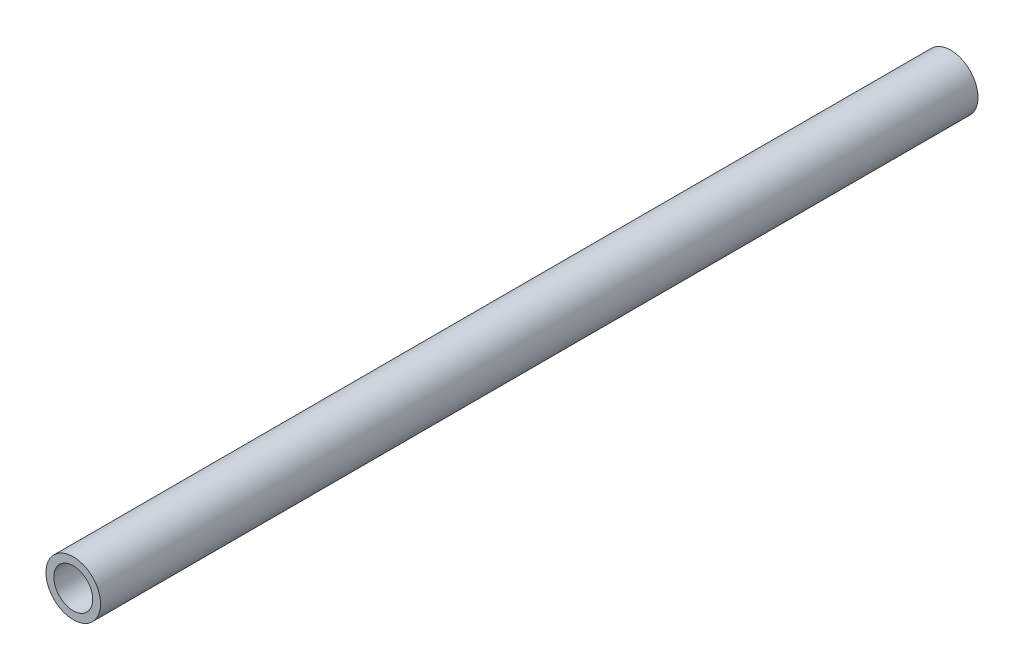
ISO-10303-21;
HEADER;
FILE_DESCRIPTION(('STEP AP214'),'2;1');
FILE_NAME('part.step','',(''),(''),'','','');
FILE_SCHEMA(('AUTOMOTIVE_DESIGN { 1 0 10303 214 1 1 1 1 }'));
ENDSEC;
DATA;
#1=APPLICATION_CONTEXT('core data for automotive mechanical design processes');
#2=APPLICATION_PROTOCOL_DEFINITION('international standard','automotive_design',2000,#1);
#3=PRODUCT_CONTEXT('',#1,'mechanical');
#4=PRODUCT('Part','Part','',(#3));
#5=PRODUCT_RELATED_PRODUCT_CATEGORY('part','',(#4));
#6=PRODUCT_DEFINITION_FORMATION('','',#4);
#7=PRODUCT_DEFINITION_CONTEXT('part definition',#1,'design');
#8=PRODUCT_DEFINITION('design','',#6,#7);
#9=PRODUCT_DEFINITION_SHAPE('','',#8);
#10=(LENGTH_UNIT() NAMED_UNIT(*) SI_UNIT(.MILLI.,.METRE.));
#11=(NAMED_UNIT(*) PLANE_ANGLE_UNIT() SI_UNIT($,.RADIAN.));
#12=(NAMED_UNIT(*) SI_UNIT($,.STERADIAN.) SOLID_ANGLE_UNIT());
#13=UNCERTAINTY_MEASURE_WITH_UNIT(LENGTH_MEASURE(1.E-05),#10,'distance_accuracy_value','');
#14=(GEOMETRIC_REPRESENTATION_CONTEXT(3) GLOBAL_UNCERTAINTY_ASSIGNED_CONTEXT((#13)) GLOBAL_UNIT_ASSIGNED_CONTEXT((#10,
#11,#12)) REPRESENTATION_CONTEXT('',''));
#15=CARTESIAN_POINT('',(0.,0.,0.));
#16=DIRECTION('',(0.,0.,1.));
#17=DIRECTION('',(1.,0.,0.));
#18=AXIS2_PLACEMENT_3D('',#15,#16,#17);
#19=CARTESIAN_POINT('',(0.,0.,225.));
#20=DIRECTION('',(0.,0.,1.));
#21=DIRECTION('',(1.,0.,0.));
#22=AXIS2_PLACEMENT_3D('',#19,#20,#21);
#23=PLANE('',#22);
#24=CARTESIAN_POINT('',(0.,0.,225.));
#25=DIRECTION('',(0.,0.,1.));
#26=DIRECTION('',(1.,0.,0.));
#27=AXIS2_PLACEMENT_3D('',#24,#25,#26);
#28=CIRCLE('',#27,7.);
#29=CARTESIAN_POINT('',(7.,0.,225.));
#30=VERTEX_POINT('',#29);
#31=EDGE_CURVE('E10',#30,#30,#28,.T.);
#32=ORIENTED_EDGE('',*,*,#31,.T.);
#33=EDGE_LOOP('',(#32));
#34=FACE_BOUND('',#33,.T.);
#35=CARTESIAN_POINT('',(0.,0.,225.));
#36=DIRECTION('',(0.,0.,1.));
#37=DIRECTION('',(1.,0.,0.));
#38=AXIS2_PLACEMENT_3D('',#35,#36,#37);
#39=CIRCLE('',#38,5.);
#40=CARTESIAN_POINT('',(5.,0.,225.));
#41=VERTEX_POINT('',#40);
#42=EDGE_CURVE('E52',#41,#41,#39,.T.);
#43=ORIENTED_EDGE('',*,*,#42,.F.);
#44=EDGE_LOOP('',(#43));
#45=FACE_BOUND('',#44,.T.);
#46=ADVANCED_FACE('F39',(#34,#45),#23,.T.);
#47=CARTESIAN_POINT('',(0.,0.,0.));
#48=DIRECTION('',(0.,0.,1.));
#49=DIRECTION('',(1.,0.,0.));
#50=AXIS2_PLACEMENT_3D('',#47,#48,#49);
#51=PLANE('',#50);
#52=CARTESIAN_POINT('',(0.,0.,0.));
#53=DIRECTION('',(0.,0.,1.));
#54=DIRECTION('',(1.,0.,0.));
#55=AXIS2_PLACEMENT_3D('',#52,#53,#54);
#56=CIRCLE('',#55,7.);
#57=CARTESIAN_POINT('',(7.,0.,0.));
#58=VERTEX_POINT('',#57);
#59=EDGE_CURVE('E43',#58,#58,#56,.T.);
#60=ORIENTED_EDGE('',*,*,#59,.F.);
#61=EDGE_LOOP('',(#60));
#62=FACE_BOUND('',#61,.T.);
#63=CARTESIAN_POINT('',(0.,0.,0.));
#64=DIRECTION('',(0.,0.,1.));
#65=DIRECTION('',(1.,0.,0.));
#66=AXIS2_PLACEMENT_3D('',#63,#64,#65);
#67=CIRCLE('',#66,5.);
#68=CARTESIAN_POINT('',(5.,0.,0.));
#69=VERTEX_POINT('',#68);
#70=EDGE_CURVE('E54',#69,#69,#67,.T.);
#71=ORIENTED_EDGE('',*,*,#70,.T.);
#72=EDGE_LOOP('',(#71));
#73=FACE_BOUND('',#72,.T.);
#74=ADVANCED_FACE('F66',(#62,#73),#51,.F.);
#75=CARTESIAN_POINT('',(0.,0.,225.));
#76=DIRECTION('',(0.,0.,-1.));
#77=DIRECTION('',(-1.,0.,0.));
#78=AXIS2_PLACEMENT_3D('',#75,#76,#77);
#79=CYLINDRICAL_SURFACE('',#78,7.);
#80=ORIENTED_EDGE('',*,*,#31,.F.);
#81=EDGE_LOOP('',(#80));
#82=FACE_BOUND('',#81,.T.);
#83=ORIENTED_EDGE('',*,*,#59,.T.);
#84=EDGE_LOOP('',(#83));
#85=FACE_BOUND('',#84,.T.);
#86=ADVANCED_FACE('F41',(#82,#85),#79,.T.);
#87=CARTESIAN_POINT('',(0.,0.,225.));
#88=DIRECTION('',(0.,0.,-1.));
#89=DIRECTION('',(-1.,0.,0.));
#90=AXIS2_PLACEMENT_3D('',#87,#88,#89);
#91=CYLINDRICAL_SURFACE('',#90,5.);
#92=ORIENTED_EDGE('',*,*,#42,.T.);
#93=EDGE_LOOP('',(#92));
#94=FACE_BOUND('',#93,.T.);
#95=ORIENTED_EDGE('',*,*,#70,.F.);
#96=EDGE_LOOP('',(#95));
#97=FACE_BOUND('',#96,.T.);
#98=ADVANCED_FACE('F62',(#94,#97),#91,.F.);
#99=CLOSED_SHELL('',(#46,#74,#86,#98));
#100=MANIFOLD_SOLID_BREP('B2',#99);
#101=ADVANCED_BREP_SHAPE_REPRESENTATION('',(#18,#100),#14);
#102=SHAPE_DEFINITION_REPRESENTATION(#9,#101);
ENDSEC;
END-ISO-10303-21;
